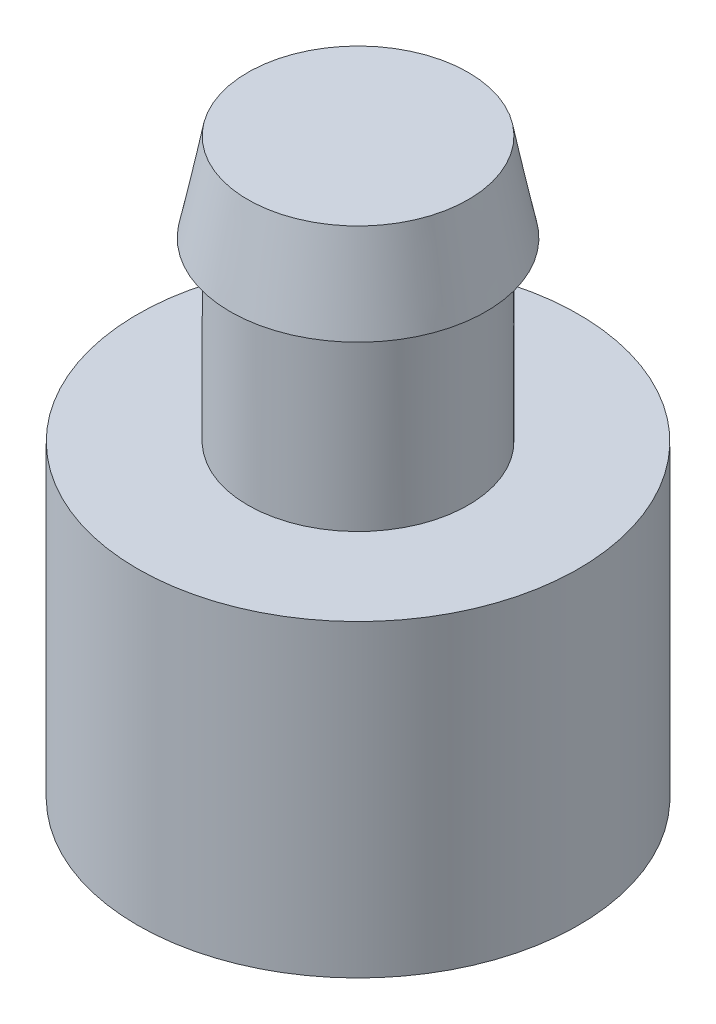
ISO-10303-21;
HEADER;
FILE_DESCRIPTION(('STEP AP214'),'2;1');
FILE_NAME('part.step','',(''),(''),'','','');
FILE_SCHEMA(('AUTOMOTIVE_DESIGN { 1 0 10303 214 1 1 1 1 }'));
ENDSEC;
DATA;
#1=APPLICATION_CONTEXT('core data for automotive mechanical design processes');
#2=APPLICATION_PROTOCOL_DEFINITION('international standard','automotive_design',2000,#1);
#3=PRODUCT_CONTEXT('',#1,'mechanical');
#4=PRODUCT('Part','Part','',(#3));
#5=PRODUCT_RELATED_PRODUCT_CATEGORY('part','',(#4));
#6=PRODUCT_DEFINITION_FORMATION('','',#4);
#7=PRODUCT_DEFINITION_CONTEXT('part definition',#1,'design');
#8=PRODUCT_DEFINITION('design','',#6,#7);
#9=PRODUCT_DEFINITION_SHAPE('','',#8);
#10=(LENGTH_UNIT() NAMED_UNIT(*) SI_UNIT(.MILLI.,.METRE.));
#11=(NAMED_UNIT(*) PLANE_ANGLE_UNIT() SI_UNIT($,.RADIAN.));
#12=(NAMED_UNIT(*) SI_UNIT($,.STERADIAN.) SOLID_ANGLE_UNIT());
#13=UNCERTAINTY_MEASURE_WITH_UNIT(LENGTH_MEASURE(1.E-05),#10,'distance_accuracy_value','');
#14=(GEOMETRIC_REPRESENTATION_CONTEXT(3) GLOBAL_UNCERTAINTY_ASSIGNED_CONTEXT((#13)) GLOBAL_UNIT_ASSIGNED_CONTEXT((#10,
#11,#12)) REPRESENTATION_CONTEXT('',''));
#15=CARTESIAN_POINT('',(0.,0.,0.));
#16=DIRECTION('',(0.,0.,1.));
#17=DIRECTION('',(1.,0.,0.));
#18=AXIS2_PLACEMENT_3D('',#15,#16,#17);
#19=CARTESIAN_POINT('',(0.,3.5,0.));
#20=DIRECTION('',(0.,-1.,0.));
#21=DIRECTION('',(0.,0.,-1.));
#22=AXIS2_PLACEMENT_3D('',#19,#20,#21);
#23=CYLINDRICAL_SURFACE('',#22,2.5);
#24=CARTESIAN_POINT('',(0.,3.5,0.));
#25=DIRECTION('',(0.,1.,0.));
#26=DIRECTION('',(0.,0.,1.));
#27=AXIS2_PLACEMENT_3D('',#24,#25,#26);
#28=CIRCLE('',#27,2.5);
#29=CARTESIAN_POINT('',(0.,3.5,2.5));
#30=VERTEX_POINT('',#29);
#31=EDGE_CURVE('E38',#30,#30,#28,.T.);
#32=ORIENTED_EDGE('',*,*,#31,.F.);
#33=EDGE_LOOP('',(#32));
#34=FACE_BOUND('',#33,.T.);
#35=CARTESIAN_POINT('',(0.,0.,0.));
#36=DIRECTION('',(0.,1.,0.));
#37=DIRECTION('',(0.,0.,1.));
#38=AXIS2_PLACEMENT_3D('',#35,#36,#37);
#39=CIRCLE('',#38,2.5);
#40=CARTESIAN_POINT('',(0.,0.,2.5));
#41=VERTEX_POINT('',#40);
#42=EDGE_CURVE('E34',#41,#41,#39,.T.);
#43=ORIENTED_EDGE('',*,*,#42,.T.);
#44=EDGE_LOOP('',(#43));
#45=FACE_BOUND('',#44,.T.);
#46=ADVANCED_FACE('F31',(#34,#45),#23,.T.);
#47=CARTESIAN_POINT('',(0.,3.5,0.));
#48=DIRECTION('',(0.,1.,0.));
#49=DIRECTION('',(0.,0.,1.));
#50=AXIS2_PLACEMENT_3D('',#47,#48,#49);
#51=PLANE('',#50);
#52=CARTESIAN_POINT('',(0.,3.5,0.));
#53=DIRECTION('',(0.,1.,0.));
#54=DIRECTION('',(0.,0.,1.));
#55=AXIS2_PLACEMENT_3D('',#52,#53,#54);
#56=CIRCLE('',#55,1.25);
#57=CARTESIAN_POINT('',(0.,3.5,1.25));
#58=VERTEX_POINT('',#57);
#59=EDGE_CURVE('E10',#58,#58,#56,.T.);
#60=ORIENTED_EDGE('',*,*,#59,.F.);
#61=EDGE_LOOP('',(#60));
#62=FACE_BOUND('',#61,.T.);
#63=ORIENTED_EDGE('',*,*,#31,.T.);
#64=EDGE_LOOP('',(#63));
#65=FACE_BOUND('',#64,.T.);
#66=ADVANCED_FACE('F69',(#62,#65),#51,.T.);
#67=CARTESIAN_POINT('',(0.,0.,0.));
#68=DIRECTION('',(0.,1.,0.));
#69=DIRECTION('',(0.,0.,1.));
#70=AXIS2_PLACEMENT_3D('',#67,#68,#69);
#71=PLANE('',#70);
#72=ORIENTED_EDGE('',*,*,#42,.F.);
#73=EDGE_LOOP('',(#72));
#74=FACE_BOUND('',#73,.T.);
#75=ADVANCED_FACE('F74',(#74),#71,.F.);
#76=CARTESIAN_POINT('',(0.,6.5,0.));
#77=DIRECTION('',(0.,-1.,0.));
#78=DIRECTION('',(0.,0.,-1.));
#79=AXIS2_PLACEMENT_3D('',#76,#77,#78);
#80=CYLINDRICAL_SURFACE('',#79,1.25);
#81=CARTESIAN_POINT('',(0.,5.5,0.));
#82=DIRECTION('',(0.,-1.,0.));
#83=DIRECTION('',(0.,0.,-1.));
#84=AXIS2_PLACEMENT_3D('',#81,#82,#83);
#85=CIRCLE('',#84,1.25);
#86=CARTESIAN_POINT('',(0.,5.5,-1.25));
#87=VERTEX_POINT('',#86);
#88=EDGE_CURVE('E47',#87,#87,#85,.T.);
#89=ORIENTED_EDGE('',*,*,#88,.T.);
#90=EDGE_LOOP('',(#89));
#91=FACE_BOUND('',#90,.T.);
#92=ORIENTED_EDGE('',*,*,#59,.T.);
#93=EDGE_LOOP('',(#92));
#94=FACE_BOUND('',#93,.T.);
#95=ADVANCED_FACE('F83',(#91,#94),#80,.T.);
#96=CARTESIAN_POINT('',(0.,5.5,0.));
#97=DIRECTION('',(0.,-1.,0.));
#98=DIRECTION('',(0.,0.,-1.));
#99=AXIS2_PLACEMENT_3D('',#96,#97,#98);
#100=CONICAL_SURFACE('',#99,1.45,0.197395559849881);
#101=CARTESIAN_POINT('',(0.,6.5,0.));
#102=DIRECTION('',(0.,-1.,0.));
#103=DIRECTION('',(0.,0.,-1.));
#104=AXIS2_PLACEMENT_3D('',#101,#102,#103);
#105=CIRCLE('',#104,1.25);
#106=CARTESIAN_POINT('',(0.,6.5,-1.25));
#107=VERTEX_POINT('',#106);
#108=EDGE_CURVE('E50',#107,#107,#105,.T.);
#109=ORIENTED_EDGE('',*,*,#108,.T.);
#110=EDGE_LOOP('',(#109));
#111=FACE_BOUND('',#110,.T.);
#112=CARTESIAN_POINT('',(0.,5.5,0.));
#113=DIRECTION('',(0.,-1.,0.));
#114=DIRECTION('',(0.,0.,-1.));
#115=AXIS2_PLACEMENT_3D('',#112,#113,#114);
#116=CIRCLE('',#115,1.45);
#117=CARTESIAN_POINT('',(0.,5.5,-1.45));
#118=VERTEX_POINT('',#117);
#119=EDGE_CURVE('E44',#118,#118,#116,.T.);
#120=ORIENTED_EDGE('',*,*,#119,.F.);
#121=EDGE_LOOP('',(#120));
#122=FACE_BOUND('',#121,.T.);
#123=ADVANCED_FACE('F54',(#111,#122),#100,.T.);
#124=CARTESIAN_POINT('',(1.25,5.5,0.));
#125=DIRECTION('',(0.,-1.,0.));
#126=DIRECTION('',(0.,0.,-1.));
#127=AXIS2_PLACEMENT_3D('',#124,#125,#126);
#128=PLANE('',#127);
#129=ORIENTED_EDGE('',*,*,#119,.T.);
#130=EDGE_LOOP('',(#129));
#131=FACE_BOUND('',#130,.T.);
#132=ORIENTED_EDGE('',*,*,#88,.F.);
#133=EDGE_LOOP('',(#132));
#134=FACE_BOUND('',#133,.T.);
#135=ADVANCED_FACE('F59',(#131,#134),#128,.T.);
#136=CARTESIAN_POINT('',(0.,6.5,0.));
#137=DIRECTION('',(0.,1.,0.));
#138=DIRECTION('',(0.,0.,1.));
#139=AXIS2_PLACEMENT_3D('',#136,#137,#138);
#140=PLANE('',#139);
#141=ORIENTED_EDGE('',*,*,#108,.F.);
#142=EDGE_LOOP('',(#141));
#143=FACE_BOUND('',#142,.T.);
#144=ADVANCED_FACE('F57',(#143),#140,.T.);
#145=CLOSED_SHELL('',(#46,#66,#75,#95,#123,#135,#144));
#146=MANIFOLD_SOLID_BREP('B2',#145);
#147=ADVANCED_BREP_SHAPE_REPRESENTATION('',(#18,#146),#14);
#148=SHAPE_DEFINITION_REPRESENTATION(#9,#147);
ENDSEC;
END-ISO-10303-21;
